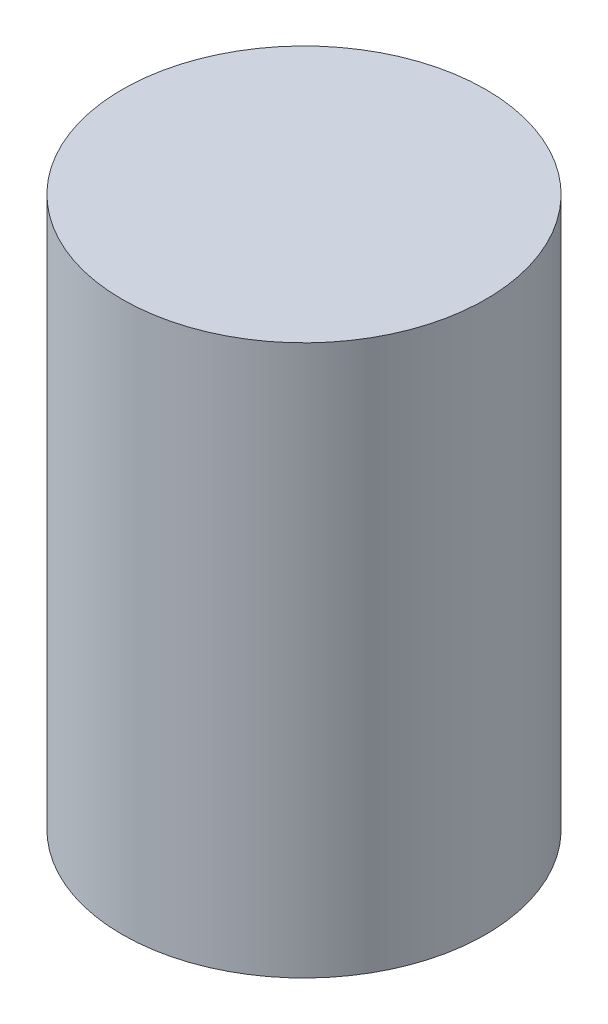
ISO-10303-21;
HEADER;
FILE_DESCRIPTION(('STEP AP214'),'2;1');
FILE_NAME('part.step','',(''),(''),'','','');
FILE_SCHEMA(('AUTOMOTIVE_DESIGN { 1 0 10303 214 1 1 1 1 }'));
ENDSEC;
DATA;
#1=APPLICATION_CONTEXT('core data for automotive mechanical design processes');
#2=APPLICATION_PROTOCOL_DEFINITION('international standard','automotive_design',2000,#1);
#3=PRODUCT_CONTEXT('',#1,'mechanical');
#4=PRODUCT('Part','Part','',(#3));
#5=PRODUCT_RELATED_PRODUCT_CATEGORY('part','',(#4));
#6=PRODUCT_DEFINITION_FORMATION('','',#4);
#7=PRODUCT_DEFINITION_CONTEXT('part definition',#1,'design');
#8=PRODUCT_DEFINITION('design','',#6,#7);
#9=PRODUCT_DEFINITION_SHAPE('','',#8);
#10=(LENGTH_UNIT() NAMED_UNIT(*) SI_UNIT(.MILLI.,.METRE.));
#11=(NAMED_UNIT(*) PLANE_ANGLE_UNIT() SI_UNIT($,.RADIAN.));
#12=(NAMED_UNIT(*) SI_UNIT($,.STERADIAN.) SOLID_ANGLE_UNIT());
#13=UNCERTAINTY_MEASURE_WITH_UNIT(LENGTH_MEASURE(1.E-05),#10,'distance_accuracy_value','');
#14=(GEOMETRIC_REPRESENTATION_CONTEXT(3) GLOBAL_UNCERTAINTY_ASSIGNED_CONTEXT((#13)) GLOBAL_UNIT_ASSIGNED_CONTEXT((#10,
#11,#12)) REPRESENTATION_CONTEXT('',''));
#15=CARTESIAN_POINT('',(0.,0.,0.));
#16=DIRECTION('',(0.,0.,1.));
#17=DIRECTION('',(1.,0.,0.));
#18=AXIS2_PLACEMENT_3D('',#15,#16,#17);
#19=CARTESIAN_POINT('',(0.,-7.5,7.5));
#20=DIRECTION('',(0.,1.,0.));
#21=DIRECTION('',(0.,0.,1.));
#22=AXIS2_PLACEMENT_3D('',#19,#20,#21);
#23=PLANE('',#22);
#24=CARTESIAN_POINT('',(0.,-7.5,0.));
#25=DIRECTION('',(0.,-1.,0.));
#26=DIRECTION('',(0.,0.,-1.));
#27=AXIS2_PLACEMENT_3D('',#24,#25,#26);
#28=CIRCLE('',#27,7.5);
#29=CARTESIAN_POINT('',(0.,-7.5,-7.5));
#30=VERTEX_POINT('',#29);
#31=EDGE_CURVE('E43',#30,#30,#28,.T.);
#32=ORIENTED_EDGE('',*,*,#31,.T.);
#33=EDGE_LOOP('',(#32));
#34=FACE_BOUND('',#33,.T.);
#35=ADVANCED_FACE('F40',(#34),#23,.F.);
#36=CARTESIAN_POINT('',(0.,15.1928836936632,7.5));
#37=DIRECTION('',(0.,-1.,0.));
#38=DIRECTION('',(0.,0.,-1.));
#39=AXIS2_PLACEMENT_3D('',#36,#37,#38);
#40=PLANE('',#39);
#41=CARTESIAN_POINT('',(0.,15.1928836936632,0.));
#42=DIRECTION('',(0.,-1.,0.));
#43=DIRECTION('',(0.,0.,-1.));
#44=AXIS2_PLACEMENT_3D('',#41,#42,#43);
#45=CIRCLE('',#44,7.5);
#46=CARTESIAN_POINT('',(0.,15.1928836936632,-7.5));
#47=VERTEX_POINT('',#46);
#48=EDGE_CURVE('E10',#47,#47,#45,.T.);
#49=ORIENTED_EDGE('',*,*,#48,.F.);
#50=EDGE_LOOP('',(#49));
#51=FACE_BOUND('',#50,.T.);
#52=ADVANCED_FACE('F55',(#51),#40,.F.);
#53=CARTESIAN_POINT('',(0.,-13.007574152829,0.));
#54=DIRECTION('',(0.,-1.,0.));
#55=DIRECTION('',(0.,0.,-1.));
#56=AXIS2_PLACEMENT_3D('',#53,#54,#55);
#57=CYLINDRICAL_SURFACE('',#56,7.5);
#58=ORIENTED_EDGE('',*,*,#31,.F.);
#59=EDGE_LOOP('',(#58));
#60=FACE_BOUND('',#59,.T.);
#61=ORIENTED_EDGE('',*,*,#48,.T.);
#62=EDGE_LOOP('',(#61));
#63=FACE_BOUND('',#62,.T.);
#64=ADVANCED_FACE('F49',(#60,#63),#57,.T.);
#65=CLOSED_SHELL('',(#35,#52,#64));
#66=MANIFOLD_SOLID_BREP('B2',#65);
#67=ADVANCED_BREP_SHAPE_REPRESENTATION('',(#18,#66),#14);
#68=SHAPE_DEFINITION_REPRESENTATION(#9,#67);
ENDSEC;
END-ISO-10303-21;
